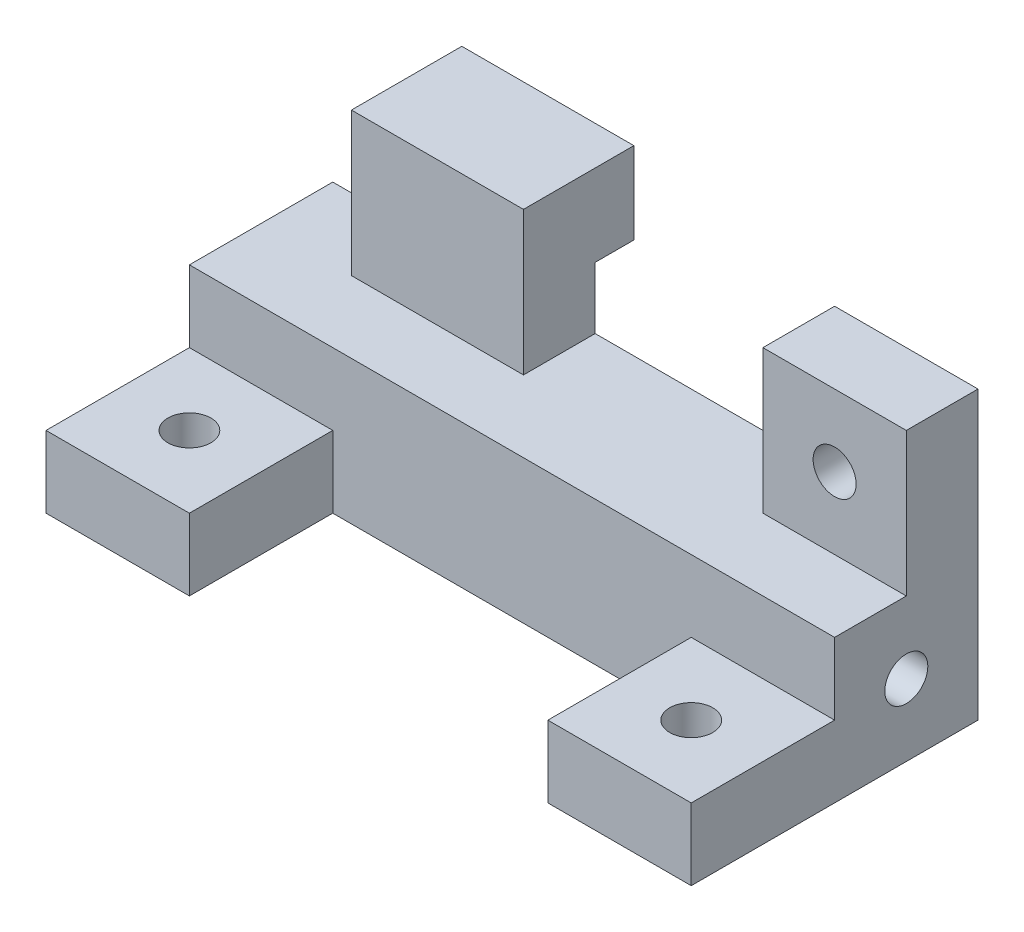
ISO-10303-21;
HEADER;
FILE_DESCRIPTION(('STEP AP214'),'2;1');
FILE_NAME('part.step','',(''),(''),'','','');
FILE_SCHEMA(('AUTOMOTIVE_DESIGN { 1 0 10303 214 1 1 1 1 }'));
ENDSEC;
DATA;
#1=APPLICATION_CONTEXT('core data for automotive mechanical design processes');
#2=APPLICATION_PROTOCOL_DEFINITION('international standard','automotive_design',2000,#1);
#3=PRODUCT_CONTEXT('',#1,'mechanical');
#4=PRODUCT('Part','Part','',(#3));
#5=PRODUCT_RELATED_PRODUCT_CATEGORY('part','',(#4));
#6=PRODUCT_DEFINITION_FORMATION('','',#4);
#7=PRODUCT_DEFINITION_CONTEXT('part definition',#1,'design');
#8=PRODUCT_DEFINITION('design','',#6,#7);
#9=PRODUCT_DEFINITION_SHAPE('','',#8);
#10=(LENGTH_UNIT() NAMED_UNIT(*) SI_UNIT(.MILLI.,.METRE.));
#11=(NAMED_UNIT(*) PLANE_ANGLE_UNIT() SI_UNIT($,.RADIAN.));
#12=(NAMED_UNIT(*) SI_UNIT($,.STERADIAN.) SOLID_ANGLE_UNIT());
#13=UNCERTAINTY_MEASURE_WITH_UNIT(LENGTH_MEASURE(1.E-05),#10,'distance_accuracy_value','');
#14=(GEOMETRIC_REPRESENTATION_CONTEXT(3) GLOBAL_UNCERTAINTY_ASSIGNED_CONTEXT((#13)) GLOBAL_UNIT_ASSIGNED_CONTEXT((#10,
#11,#12)) REPRESENTATION_CONTEXT('',''));
#15=CARTESIAN_POINT('',(0.,0.,0.));
#16=DIRECTION('',(0.,0.,1.));
#17=DIRECTION('',(1.,0.,0.));
#18=AXIS2_PLACEMENT_3D('',#15,#16,#17);
#19=CARTESIAN_POINT('',(0.,0.,10.));
#20=DIRECTION('',(0.,0.,-1.));
#21=DIRECTION('',(-1.,0.,0.));
#22=AXIS2_PLACEMENT_3D('',#19,#20,#21);
#23=PLANE('',#22);
#24=DIRECTION('',(-1.,0.,0.));
#25=VECTOR('',#24,1.);
#26=CARTESIAN_POINT('',(45.,5.,10.));
#27=LINE('',#26,#25);
#28=CARTESIAN_POINT('',(45.,5.,10.));
#29=VERTEX_POINT('',#28);
#30=CARTESIAN_POINT('',(35.,5.,10.));
#31=VERTEX_POINT('',#30);
#32=EDGE_CURVE('E230',#29,#31,#27,.T.);
#33=ORIENTED_EDGE('',*,*,#32,.F.);
#34=DIRECTION('',(0.,1.,0.));
#35=VECTOR('',#34,1.);
#36=CARTESIAN_POINT('',(45.,0.,10.));
#37=LINE('',#36,#35);
#38=CARTESIAN_POINT('',(45.,10.,10.));
#39=VERTEX_POINT('',#38);
#40=EDGE_CURVE('E325',#29,#39,#37,.T.);
#41=ORIENTED_EDGE('',*,*,#40,.T.);
#42=DIRECTION('',(-1.,0.,0.));
#43=VECTOR('',#42,1.);
#44=CARTESIAN_POINT('',(0.,10.,10.));
#45=LINE('',#44,#43);
#46=CARTESIAN_POINT('',(0.,10.,10.));
#47=VERTEX_POINT('',#46);
#48=EDGE_CURVE('E327',#39,#47,#45,.T.);
#49=ORIENTED_EDGE('',*,*,#48,.T.);
#50=DIRECTION('',(0.,-1.,0.));
#51=VECTOR('',#50,1.);
#52=CARTESIAN_POINT('',(0.,0.,10.));
#53=LINE('',#52,#51);
#54=CARTESIAN_POINT('',(0.,5.,10.));
#55=VERTEX_POINT('',#54);
#56=EDGE_CURVE('E320',#47,#55,#53,.T.);
#57=ORIENTED_EDGE('',*,*,#56,.T.);
#58=DIRECTION('',(-1.,0.,0.));
#59=VECTOR('',#58,1.);
#60=CARTESIAN_POINT('',(0.,5.,10.));
#61=LINE('',#60,#59);
#62=CARTESIAN_POINT('',(10.,5.,10.));
#63=VERTEX_POINT('',#62);
#64=EDGE_CURVE('E259',#63,#55,#61,.T.);
#65=ORIENTED_EDGE('',*,*,#64,.F.);
#66=DIRECTION('',(0.,1.,0.));
#67=VECTOR('',#66,1.);
#68=CARTESIAN_POINT('',(10.,0.,10.));
#69=LINE('',#68,#67);
#70=CARTESIAN_POINT('',(9.99999999999999,0.,10.));
#71=VERTEX_POINT('',#70);
#72=EDGE_CURVE('E254',#71,#63,#69,.T.);
#73=ORIENTED_EDGE('',*,*,#72,.F.);
#74=DIRECTION('',(1.,0.,0.));
#75=VECTOR('',#74,1.);
#76=CARTESIAN_POINT('',(0.,0.,10.));
#77=LINE('',#76,#75);
#78=CARTESIAN_POINT('',(35.,0.,10.));
#79=VERTEX_POINT('',#78);
#80=EDGE_CURVE('E322',#71,#79,#77,.T.);
#81=ORIENTED_EDGE('',*,*,#80,.T.);
#82=DIRECTION('',(0.,-1.,0.));
#83=VECTOR('',#82,1.);
#84=CARTESIAN_POINT('',(35.,0.,10.));
#85=LINE('',#84,#83);
#86=EDGE_CURVE('E56',#31,#79,#85,.T.);
#87=ORIENTED_EDGE('',*,*,#86,.F.);
#88=EDGE_LOOP('',(#33,#41,#49,#57,#65,#73,#81,#87));
#89=FACE_BOUND('',#88,.T.);
#90=ADVANCED_FACE('F33',(#89),#23,.F.);
#91=CARTESIAN_POINT('',(0.,10.,10.));
#92=DIRECTION('',(0.,-1.,0.));
#93=DIRECTION('',(0.,0.,-1.));
#94=AXIS2_PLACEMENT_3D('',#91,#92,#93);
#95=PLANE('',#94);
#96=DIRECTION('',(0.,0.,1.));
#97=VECTOR('',#96,1.);
#98=CARTESIAN_POINT('',(6.3,10.,0.));
#99=LINE('',#98,#97);
#100=CARTESIAN_POINT('',(6.3,10.,0.));
#101=VERTEX_POINT('',#100);
#102=CARTESIAN_POINT('',(6.3,10.,5.));
#103=VERTEX_POINT('',#102);
#104=EDGE_CURVE('E277',#101,#103,#99,.T.);
#105=ORIENTED_EDGE('',*,*,#104,.F.);
#106=DIRECTION('',(-1.,0.,0.));
#107=VECTOR('',#106,1.);
#108=CARTESIAN_POINT('',(0.,10.,0.));
#109=LINE('',#108,#107);
#110=CARTESIAN_POINT('',(0.,10.,0.));
#111=VERTEX_POINT('',#110);
#112=EDGE_CURVE('E336',#101,#111,#109,.T.);
#113=ORIENTED_EDGE('',*,*,#112,.T.);
#114=DIRECTION('',(0.,0.,-1.));
#115=VECTOR('',#114,1.);
#116=CARTESIAN_POINT('',(0.,10.,10.));
#117=LINE('',#116,#115);
#118=EDGE_CURVE('E329',#47,#111,#117,.T.);
#119=ORIENTED_EDGE('',*,*,#118,.F.);
#120=ORIENTED_EDGE('',*,*,#48,.F.);
#121=DIRECTION('',(0.,0.,-1.));
#122=VECTOR('',#121,1.);
#123=CARTESIAN_POINT('',(45.,10.,10.));
#124=LINE('',#123,#122);
#125=CARTESIAN_POINT('',(45.,10.,5.));
#126=VERTEX_POINT('',#125);
#127=EDGE_CURVE('E341',#39,#126,#124,.T.);
#128=ORIENTED_EDGE('',*,*,#127,.T.);
#129=DIRECTION('',(1.,0.,0.));
#130=VECTOR('',#129,1.);
#131=CARTESIAN_POINT('',(45.,10.,5.));
#132=LINE('',#131,#130);
#133=CARTESIAN_POINT('',(35.,10.,5.));
#134=VERTEX_POINT('',#133);
#135=EDGE_CURVE('E300',#134,#126,#132,.T.);
#136=ORIENTED_EDGE('',*,*,#135,.F.);
#137=DIRECTION('',(0.,0.,1.));
#138=VECTOR('',#137,1.);
#139=CARTESIAN_POINT('',(35.,10.,0.));
#140=LINE('',#139,#138);
#141=CARTESIAN_POINT('',(35.,10.,0.));
#142=VERTEX_POINT('',#141);
#143=EDGE_CURVE('E295',#142,#134,#140,.T.);
#144=ORIENTED_EDGE('',*,*,#143,.F.);
#145=CARTESIAN_POINT('',(18.3,10.,0.));
#146=VERTEX_POINT('',#145);
#147=EDGE_CURVE('E323',#142,#146,#109,.T.);
#148=ORIENTED_EDGE('',*,*,#147,.T.);
#149=DIRECTION('',(0.,0.,-1.));
#150=VECTOR('',#149,1.);
#151=CARTESIAN_POINT('',(18.3,10.,0.));
#152=LINE('',#151,#150);
#153=CARTESIAN_POINT('',(18.3,10.,5.));
#154=VERTEX_POINT('',#153);
#155=EDGE_CURVE('E177',#154,#146,#152,.T.);
#156=ORIENTED_EDGE('',*,*,#155,.F.);
#157=DIRECTION('',(1.,0.,0.));
#158=VECTOR('',#157,1.);
#159=CARTESIAN_POINT('',(6.3,10.,5.));
#160=LINE('',#159,#158);
#161=EDGE_CURVE('E283',#103,#154,#160,.T.);
#162=ORIENTED_EDGE('',*,*,#161,.F.);
#163=EDGE_LOOP('',(#105,#113,#119,#120,#128,#136,#144,#148,#156,#162));
#164=FACE_BOUND('',#163,.T.);
#165=ADVANCED_FACE('F369',(#164),#95,.F.);
#166=CARTESIAN_POINT('',(0.,0.,10.));
#167=DIRECTION('',(1.,0.,0.));
#168=DIRECTION('',(0.,0.,-1.));
#169=AXIS2_PLACEMENT_3D('',#166,#167,#168);
#170=PLANE('',#169);
#171=CARTESIAN_POINT('',(0.,5.,5.));
#172=DIRECTION('',(-1.,0.,0.));
#173=DIRECTION('',(0.,0.,1.));
#174=AXIS2_PLACEMENT_3D('',#171,#172,#173);
#175=CIRCLE('',#174,1.5);
#176=CARTESIAN_POINT('',(0.,5.,6.5));
#177=VERTEX_POINT('',#176);
#178=EDGE_CURVE('E224',#177,#177,#175,.T.);
#179=ORIENTED_EDGE('',*,*,#178,.F.);
#180=EDGE_LOOP('',(#179));
#181=FACE_BOUND('',#180,.T.);
#182=DIRECTION('',(0.,-1.,0.));
#183=VECTOR('',#182,1.);
#184=CARTESIAN_POINT('',(0.,0.,0.));
#185=LINE('',#184,#183);
#186=CARTESIAN_POINT('',(0.,0.,0.));
#187=VERTEX_POINT('',#186);
#188=EDGE_CURVE('E319',#111,#187,#185,.T.);
#189=ORIENTED_EDGE('',*,*,#188,.T.);
#190=DIRECTION('',(0.,0.,-1.));
#191=VECTOR('',#190,1.);
#192=CARTESIAN_POINT('',(0.,0.,10.));
#193=LINE('',#192,#191);
#194=CARTESIAN_POINT('',(0.,0.,20.));
#195=VERTEX_POINT('',#194);
#196=EDGE_CURVE('E11',#195,#187,#193,.T.);
#197=ORIENTED_EDGE('',*,*,#196,.F.);
#198=DIRECTION('',(0.,-1.,0.));
#199=VECTOR('',#198,1.);
#200=CARTESIAN_POINT('',(0.,0.,20.));
#201=LINE('',#200,#199);
#202=CARTESIAN_POINT('',(0.,5.,20.));
#203=VERTEX_POINT('',#202);
#204=EDGE_CURVE('E255',#203,#195,#201,.T.);
#205=ORIENTED_EDGE('',*,*,#204,.F.);
#206=DIRECTION('',(0.,0.,-1.));
#207=VECTOR('',#206,1.);
#208=CARTESIAN_POINT('',(0.,5.,20.));
#209=LINE('',#208,#207);
#210=EDGE_CURVE('E265',#203,#55,#209,.T.);
#211=ORIENTED_EDGE('',*,*,#210,.T.);
#212=ORIENTED_EDGE('',*,*,#56,.F.);
#213=ORIENTED_EDGE('',*,*,#118,.T.);
#214=EDGE_LOOP('',(#189,#197,#205,#211,#212,#213));
#215=FACE_BOUND('',#214,.T.);
#216=ADVANCED_FACE('F35',(#181,#215),#170,.F.);
#217=CARTESIAN_POINT('',(0.,0.,10.));
#218=DIRECTION('',(0.,1.,0.));
#219=DIRECTION('',(0.,0.,1.));
#220=AXIS2_PLACEMENT_3D('',#217,#218,#219);
#221=PLANE('',#220);
#222=CARTESIAN_POINT('',(40.,0.,15.));
#223=DIRECTION('',(0.,1.,0.));
#224=DIRECTION('',(-1.,0.,0.));
#225=AXIS2_PLACEMENT_3D('',#222,#223,#224);
#226=CIRCLE('',#225,1.5);
#227=CARTESIAN_POINT('',(38.5,0.,15.));
#228=VERTEX_POINT('',#227);
#229=EDGE_CURVE('E209',#228,#228,#226,.T.);
#230=ORIENTED_EDGE('',*,*,#229,.T.);
#231=EDGE_LOOP('',(#230));
#232=FACE_BOUND('',#231,.T.);
#233=CARTESIAN_POINT('',(5.,0.,15.));
#234=DIRECTION('',(0.,1.,0.));
#235=DIRECTION('',(0.,0.,1.));
#236=AXIS2_PLACEMENT_3D('',#233,#234,#235);
#237=CIRCLE('',#236,1.5);
#238=CARTESIAN_POINT('',(5.,0.,16.5));
#239=VERTEX_POINT('',#238);
#240=EDGE_CURVE('E221',#239,#239,#237,.T.);
#241=ORIENTED_EDGE('',*,*,#240,.T.);
#242=EDGE_LOOP('',(#241));
#243=FACE_BOUND('',#242,.T.);
#244=DIRECTION('',(1.,0.,0.));
#245=VECTOR('',#244,1.);
#246=CARTESIAN_POINT('',(0.,0.,0.));
#247=LINE('',#246,#245);
#248=CARTESIAN_POINT('',(45.,0.,0.));
#249=VERTEX_POINT('',#248);
#250=EDGE_CURVE('E332',#187,#249,#247,.T.);
#251=ORIENTED_EDGE('',*,*,#250,.T.);
#252=DIRECTION('',(0.,0.,-1.));
#253=VECTOR('',#252,1.);
#254=CARTESIAN_POINT('',(45.,0.,10.));
#255=LINE('',#254,#253);
#256=CARTESIAN_POINT('',(45.,0.,20.));
#257=VERTEX_POINT('',#256);
#258=EDGE_CURVE('E41',#257,#249,#255,.T.);
#259=ORIENTED_EDGE('',*,*,#258,.F.);
#260=DIRECTION('',(1.,0.,0.));
#261=VECTOR('',#260,1.);
#262=CARTESIAN_POINT('',(45.,0.,20.));
#263=LINE('',#262,#261);
#264=CARTESIAN_POINT('',(35.,0.,20.));
#265=VERTEX_POINT('',#264);
#266=EDGE_CURVE('E240',#265,#257,#263,.T.);
#267=ORIENTED_EDGE('',*,*,#266,.F.);
#268=DIRECTION('',(0.,0.,-1.));
#269=VECTOR('',#268,1.);
#270=CARTESIAN_POINT('',(35.,0.,20.));
#271=LINE('',#270,#269);
#272=EDGE_CURVE('E243',#265,#79,#271,.T.);
#273=ORIENTED_EDGE('',*,*,#272,.T.);
#274=ORIENTED_EDGE('',*,*,#80,.F.);
#275=DIRECTION('',(0.,0.,-1.));
#276=VECTOR('',#275,1.);
#277=CARTESIAN_POINT('',(10.,0.,20.));
#278=LINE('',#277,#276);
#279=CARTESIAN_POINT('',(10.,0.,20.));
#280=VERTEX_POINT('',#279);
#281=EDGE_CURVE('E275',#280,#71,#278,.T.);
#282=ORIENTED_EDGE('',*,*,#281,.F.);
#283=DIRECTION('',(1.,0.,0.));
#284=VECTOR('',#283,1.);
#285=CARTESIAN_POINT('',(0.,0.,20.));
#286=LINE('',#285,#284);
#287=EDGE_CURVE('E258',#195,#280,#286,.T.);
#288=ORIENTED_EDGE('',*,*,#287,.F.);
#289=ORIENTED_EDGE('',*,*,#196,.T.);
#290=EDGE_LOOP('',(#251,#259,#267,#273,#274,#282,#288,#289));
#291=FACE_BOUND('',#290,.T.);
#292=ADVANCED_FACE('F389',(#232,#243,#291),#221,.F.);
#293=CARTESIAN_POINT('',(45.,0.,10.));
#294=DIRECTION('',(-1.,0.,0.));
#295=DIRECTION('',(0.,0.,1.));
#296=AXIS2_PLACEMENT_3D('',#293,#294,#295);
#297=PLANE('',#296);
#298=CARTESIAN_POINT('',(45.,5.,5.));
#299=DIRECTION('',(1.,0.,0.));
#300=DIRECTION('',(0.,0.,-1.));
#301=AXIS2_PLACEMENT_3D('',#298,#299,#300);
#302=CIRCLE('',#301,1.5);
#303=CARTESIAN_POINT('',(45.,5.,3.5));
#304=VERTEX_POINT('',#303);
#305=EDGE_CURVE('E212',#304,#304,#302,.T.);
#306=ORIENTED_EDGE('',*,*,#305,.F.);
#307=EDGE_LOOP('',(#306));
#308=FACE_BOUND('',#307,.T.);
#309=DIRECTION('',(0.,1.,0.));
#310=VECTOR('',#309,1.);
#311=CARTESIAN_POINT('',(45.,0.,0.));
#312=LINE('',#311,#310);
#313=CARTESIAN_POINT('',(45.,20.,0.));
#314=VERTEX_POINT('',#313);
#315=EDGE_CURVE('E334',#249,#314,#312,.T.);
#316=ORIENTED_EDGE('',*,*,#315,.T.);
#317=DIRECTION('',(0.,0.,-1.));
#318=VECTOR('',#317,1.);
#319=CARTESIAN_POINT('',(45.,20.,0.));
#320=LINE('',#319,#318);
#321=CARTESIAN_POINT('',(45.,20.,5.));
#322=VERTEX_POINT('',#321);
#323=EDGE_CURVE('E296',#322,#314,#320,.T.);
#324=ORIENTED_EDGE('',*,*,#323,.F.);
#325=DIRECTION('',(0.,-1.,0.));
#326=VECTOR('',#325,1.);
#327=CARTESIAN_POINT('',(45.,20.,5.));
#328=LINE('',#327,#326);
#329=EDGE_CURVE('E306',#322,#126,#328,.T.);
#330=ORIENTED_EDGE('',*,*,#329,.T.);
#331=ORIENTED_EDGE('',*,*,#127,.F.);
#332=ORIENTED_EDGE('',*,*,#40,.F.);
#333=DIRECTION('',(0.,0.,-1.));
#334=VECTOR('',#333,1.);
#335=CARTESIAN_POINT('',(45.,5.,20.));
#336=LINE('',#335,#334);
#337=CARTESIAN_POINT('',(45.,5.,20.));
#338=VERTEX_POINT('',#337);
#339=EDGE_CURVE('E251',#338,#29,#336,.T.);
#340=ORIENTED_EDGE('',*,*,#339,.F.);
#341=DIRECTION('',(0.,1.,0.));
#342=VECTOR('',#341,1.);
#343=CARTESIAN_POINT('',(45.,0.,20.));
#344=LINE('',#343,#342);
#345=EDGE_CURVE('E233',#257,#338,#344,.T.);
#346=ORIENTED_EDGE('',*,*,#345,.F.);
#347=ORIENTED_EDGE('',*,*,#258,.T.);
#348=EDGE_LOOP('',(#316,#324,#330,#331,#332,#340,#346,#347));
#349=FACE_BOUND('',#348,.T.);
#350=ADVANCED_FACE('F346',(#308,#349),#297,.F.);
#351=CARTESIAN_POINT('',(0.,0.,0.));
#352=DIRECTION('',(0.,0.,-1.));
#353=DIRECTION('',(-1.,0.,0.));
#354=AXIS2_PLACEMENT_3D('',#351,#352,#353);
#355=PLANE('',#354);
#356=DIRECTION('',(-1.,0.,0.));
#357=VECTOR('',#356,1.);
#358=CARTESIAN_POINT('',(6.3,14.2999999999999,0.));
#359=LINE('',#358,#357);
#360=CARTESIAN_POINT('',(18.3,14.2999999999999,0.));
#361=VERTEX_POINT('',#360);
#362=CARTESIAN_POINT('',(6.3,14.2999999999999,0.));
#363=VERTEX_POINT('',#362);
#364=EDGE_CURVE('E48',#361,#363,#359,.T.);
#365=ORIENTED_EDGE('',*,*,#364,.F.);
#366=DIRECTION('',(0.,-1.,0.));
#367=VECTOR('',#366,1.);
#368=CARTESIAN_POINT('',(18.3,20.,0.));
#369=LINE('',#368,#367);
#370=EDGE_CURVE('E289',#361,#146,#369,.T.);
#371=ORIENTED_EDGE('',*,*,#370,.T.);
#372=ORIENTED_EDGE('',*,*,#147,.F.);
#373=DIRECTION('',(0.,-1.,0.));
#374=VECTOR('',#373,1.);
#375=CARTESIAN_POINT('',(35.,20.,0.));
#376=LINE('',#375,#374);
#377=CARTESIAN_POINT('',(35.,20.,0.));
#378=VERTEX_POINT('',#377);
#379=EDGE_CURVE('E316',#378,#142,#376,.T.);
#380=ORIENTED_EDGE('',*,*,#379,.F.);
#381=DIRECTION('',(-1.,0.,0.));
#382=VECTOR('',#381,1.);
#383=CARTESIAN_POINT('',(45.,20.,0.));
#384=LINE('',#383,#382);
#385=EDGE_CURVE('E299',#314,#378,#384,.T.);
#386=ORIENTED_EDGE('',*,*,#385,.F.);
#387=ORIENTED_EDGE('',*,*,#315,.F.);
#388=ORIENTED_EDGE('',*,*,#250,.F.);
#389=ORIENTED_EDGE('',*,*,#188,.F.);
#390=ORIENTED_EDGE('',*,*,#112,.F.);
#391=DIRECTION('',(0.,-1.,0.));
#392=VECTOR('',#391,1.);
#393=CARTESIAN_POINT('',(6.3,20.,0.));
#394=LINE('',#393,#392);
#395=EDGE_CURVE('E281',#363,#101,#394,.T.);
#396=ORIENTED_EDGE('',*,*,#395,.F.);
#397=EDGE_LOOP('',(#365,#371,#372,#380,#386,#387,#388,#389,#390,#396));
#398=FACE_BOUND('',#397,.T.);
#399=CARTESIAN_POINT('',(40.,15.,0.));
#400=DIRECTION('',(0.,0.,1.));
#401=DIRECTION('',(1.,0.,0.));
#402=AXIS2_PLACEMENT_3D('',#399,#400,#401);
#403=CIRCLE('',#402,1.5);
#404=CARTESIAN_POINT('',(41.5,15.,0.));
#405=VERTEX_POINT('',#404);
#406=EDGE_CURVE('E203',#405,#405,#403,.T.);
#407=ORIENTED_EDGE('',*,*,#406,.T.);
#408=EDGE_LOOP('',(#407));
#409=FACE_BOUND('',#408,.T.);
#410=ADVANCED_FACE('F352',(#398,#409),#355,.T.);
#411=CARTESIAN_POINT('',(35.,20.,0.));
#412=DIRECTION('',(1.,0.,0.));
#413=DIRECTION('',(0.,0.,-1.));
#414=AXIS2_PLACEMENT_3D('',#411,#412,#413);
#415=PLANE('',#414);
#416=ORIENTED_EDGE('',*,*,#143,.T.);
#417=DIRECTION('',(0.,-1.,0.));
#418=VECTOR('',#417,1.);
#419=CARTESIAN_POINT('',(35.,20.,5.));
#420=LINE('',#419,#418);
#421=CARTESIAN_POINT('',(35.,20.,5.));
#422=VERTEX_POINT('',#421);
#423=EDGE_CURVE('E313',#422,#134,#420,.T.);
#424=ORIENTED_EDGE('',*,*,#423,.F.);
#425=DIRECTION('',(0.,0.,1.));
#426=VECTOR('',#425,1.);
#427=CARTESIAN_POINT('',(35.,20.,0.));
#428=LINE('',#427,#426);
#429=EDGE_CURVE('E302',#378,#422,#428,.T.);
#430=ORIENTED_EDGE('',*,*,#429,.F.);
#431=ORIENTED_EDGE('',*,*,#379,.T.);
#432=EDGE_LOOP('',(#416,#424,#430,#431));
#433=FACE_BOUND('',#432,.T.);
#434=ADVANCED_FACE('F371',(#433),#415,.F.);
#435=CARTESIAN_POINT('',(45.,20.,5.));
#436=DIRECTION('',(0.,0.,-1.));
#437=DIRECTION('',(-1.,0.,0.));
#438=AXIS2_PLACEMENT_3D('',#435,#436,#437);
#439=PLANE('',#438);
#440=CARTESIAN_POINT('',(40.,15.,5.));
#441=DIRECTION('',(0.,0.,1.));
#442=DIRECTION('',(1.,0.,0.));
#443=AXIS2_PLACEMENT_3D('',#440,#441,#442);
#444=CIRCLE('',#443,1.5);
#445=CARTESIAN_POINT('',(41.5,15.,5.));
#446=VERTEX_POINT('',#445);
#447=EDGE_CURVE('E202',#446,#446,#444,.T.);
#448=ORIENTED_EDGE('',*,*,#447,.F.);
#449=EDGE_LOOP('',(#448));
#450=FACE_BOUND('',#449,.T.);
#451=ORIENTED_EDGE('',*,*,#135,.T.);
#452=ORIENTED_EDGE('',*,*,#329,.F.);
#453=DIRECTION('',(1.,0.,0.));
#454=VECTOR('',#453,1.);
#455=CARTESIAN_POINT('',(45.,20.,5.));
#456=LINE('',#455,#454);
#457=EDGE_CURVE('E304',#422,#322,#456,.T.);
#458=ORIENTED_EDGE('',*,*,#457,.F.);
#459=ORIENTED_EDGE('',*,*,#423,.T.);
#460=EDGE_LOOP('',(#451,#452,#458,#459));
#461=FACE_BOUND('',#460,.T.);
#462=ADVANCED_FACE('F365',(#450,#461),#439,.F.);
#463=CARTESIAN_POINT('',(0.,20.,0.));
#464=DIRECTION('',(0.,-1.,0.));
#465=DIRECTION('',(0.,0.,-1.));
#466=AXIS2_PLACEMENT_3D('',#463,#464,#465);
#467=PLANE('',#466);
#468=ORIENTED_EDGE('',*,*,#323,.T.);
#469=ORIENTED_EDGE('',*,*,#385,.T.);
#470=ORIENTED_EDGE('',*,*,#429,.T.);
#471=ORIENTED_EDGE('',*,*,#457,.T.);
#472=EDGE_LOOP('',(#468,#469,#470,#471));
#473=FACE_BOUND('',#472,.T.);
#474=ADVANCED_FACE('F359',(#473),#467,.F.);
#475=CARTESIAN_POINT('',(6.3,20.,0.));
#476=DIRECTION('',(1.,0.,0.));
#477=DIRECTION('',(0.,0.,-1.));
#478=AXIS2_PLACEMENT_3D('',#475,#476,#477);
#479=PLANE('',#478);
#480=ORIENTED_EDGE('',*,*,#104,.T.);
#481=DIRECTION('',(0.,-1.,0.));
#482=VECTOR('',#481,1.);
#483=CARTESIAN_POINT('',(6.3,20.,5.));
#484=LINE('',#483,#482);
#485=CARTESIAN_POINT('',(6.3,20.,5.));
#486=VERTEX_POINT('',#485);
#487=EDGE_CURVE('E174',#486,#103,#484,.T.);
#488=ORIENTED_EDGE('',*,*,#487,.F.);
#489=DIRECTION('',(0.,0.,1.));
#490=VECTOR('',#489,1.);
#491=CARTESIAN_POINT('',(6.3,20.,0.));
#492=LINE('',#491,#490);
#493=CARTESIAN_POINT('',(6.3,20.,-2.7));
#494=VERTEX_POINT('',#493);
#495=EDGE_CURVE('E166',#494,#486,#492,.T.);
#496=ORIENTED_EDGE('',*,*,#495,.F.);
#497=DIRECTION('',(0.,1.,0.));
#498=VECTOR('',#497,1.);
#499=CARTESIAN_POINT('',(6.3,20.,-2.7));
#500=LINE('',#499,#498);
#501=CARTESIAN_POINT('',(6.3,14.2999999999999,-2.7));
#502=VERTEX_POINT('',#501);
#503=EDGE_CURVE('E172',#502,#494,#500,.T.);
#504=ORIENTED_EDGE('',*,*,#503,.F.);
#505=DIRECTION('',(0.,0.,1.));
#506=VECTOR('',#505,1.);
#507=CARTESIAN_POINT('',(6.3,14.2999999999999,-2.7));
#508=LINE('',#507,#506);
#509=EDGE_CURVE('E196',#502,#363,#508,.T.);
#510=ORIENTED_EDGE('',*,*,#509,.T.);
#511=ORIENTED_EDGE('',*,*,#395,.T.);
#512=EDGE_LOOP('',(#480,#488,#496,#504,#510,#511));
#513=FACE_BOUND('',#512,.T.);
#514=ADVANCED_FACE('F169',(#513),#479,.F.);
#515=CARTESIAN_POINT('',(6.3,20.,5.));
#516=DIRECTION('',(0.,0.,-1.));
#517=DIRECTION('',(-1.,0.,0.));
#518=AXIS2_PLACEMENT_3D('',#515,#516,#517);
#519=PLANE('',#518);
#520=ORIENTED_EDGE('',*,*,#161,.T.);
#521=DIRECTION('',(0.,-1.,0.));
#522=VECTOR('',#521,1.);
#523=CARTESIAN_POINT('',(18.3,20.,5.));
#524=LINE('',#523,#522);
#525=CARTESIAN_POINT('',(18.3,20.,5.));
#526=VERTEX_POINT('',#525);
#527=EDGE_CURVE('E291',#526,#154,#524,.T.);
#528=ORIENTED_EDGE('',*,*,#527,.F.);
#529=DIRECTION('',(1.,0.,0.));
#530=VECTOR('',#529,1.);
#531=CARTESIAN_POINT('',(6.3,20.,5.));
#532=LINE('',#531,#530);
#533=EDGE_CURVE('E176',#486,#526,#532,.T.);
#534=ORIENTED_EDGE('',*,*,#533,.F.);
#535=ORIENTED_EDGE('',*,*,#487,.T.);
#536=EDGE_LOOP('',(#520,#528,#534,#535));
#537=FACE_BOUND('',#536,.T.);
#538=ADVANCED_FACE('F414',(#537),#519,.F.);
#539=CARTESIAN_POINT('',(18.3,20.,0.));
#540=DIRECTION('',(-1.,0.,0.));
#541=DIRECTION('',(0.,0.,1.));
#542=AXIS2_PLACEMENT_3D('',#539,#540,#541);
#543=PLANE('',#542);
#544=ORIENTED_EDGE('',*,*,#155,.T.);
#545=ORIENTED_EDGE('',*,*,#370,.F.);
#546=DIRECTION('',(0.,0.,1.));
#547=VECTOR('',#546,1.);
#548=CARTESIAN_POINT('',(18.3,14.2999999999999,-2.7));
#549=LINE('',#548,#547);
#550=CARTESIAN_POINT('',(18.3,14.2999999999999,-2.7));
#551=VERTEX_POINT('',#550);
#552=EDGE_CURVE('E199',#551,#361,#549,.T.);
#553=ORIENTED_EDGE('',*,*,#552,.F.);
#554=DIRECTION('',(0.,-1.,0.));
#555=VECTOR('',#554,1.);
#556=CARTESIAN_POINT('',(18.3,20.,-2.7));
#557=LINE('',#556,#555);
#558=CARTESIAN_POINT('',(18.3,20.,-2.7));
#559=VERTEX_POINT('',#558);
#560=EDGE_CURVE('E186',#559,#551,#557,.T.);
#561=ORIENTED_EDGE('',*,*,#560,.F.);
#562=DIRECTION('',(0.,0.,-1.));
#563=VECTOR('',#562,1.);
#564=CARTESIAN_POINT('',(18.3,20.,0.));
#565=LINE('',#564,#563);
#566=EDGE_CURVE('E183',#526,#559,#565,.T.);
#567=ORIENTED_EDGE('',*,*,#566,.F.);
#568=ORIENTED_EDGE('',*,*,#527,.T.);
#569=EDGE_LOOP('',(#544,#545,#553,#561,#567,#568));
#570=FACE_BOUND('',#569,.T.);
#571=ADVANCED_FACE('F411',(#570),#543,.F.);
#572=CARTESIAN_POINT('',(0.,20.,0.));
#573=DIRECTION('',(0.,1.,0.));
#574=DIRECTION('',(0.,0.,1.));
#575=AXIS2_PLACEMENT_3D('',#572,#573,#574);
#576=PLANE('',#575);
#577=ORIENTED_EDGE('',*,*,#495,.T.);
#578=ORIENTED_EDGE('',*,*,#533,.T.);
#579=ORIENTED_EDGE('',*,*,#566,.T.);
#580=DIRECTION('',(1.,0.,0.));
#581=VECTOR('',#580,1.);
#582=CARTESIAN_POINT('',(6.3,20.,-2.7));
#583=LINE('',#582,#581);
#584=EDGE_CURVE('E180',#494,#559,#583,.T.);
#585=ORIENTED_EDGE('',*,*,#584,.F.);
#586=EDGE_LOOP('',(#577,#578,#579,#585));
#587=FACE_BOUND('',#586,.T.);
#588=ADVANCED_FACE('F181',(#587),#576,.T.);
#589=CARTESIAN_POINT('',(10.,0.,20.));
#590=DIRECTION('',(-1.,0.,0.));
#591=DIRECTION('',(0.,-1.,0.));
#592=AXIS2_PLACEMENT_3D('',#589,#590,#591);
#593=PLANE('',#592);
#594=ORIENTED_EDGE('',*,*,#72,.T.);
#595=DIRECTION('',(0.,0.,-1.));
#596=VECTOR('',#595,1.);
#597=CARTESIAN_POINT('',(10.,5.,20.));
#598=LINE('',#597,#596);
#599=CARTESIAN_POINT('',(10.,5.,20.));
#600=VERTEX_POINT('',#599);
#601=EDGE_CURVE('E272',#600,#63,#598,.T.);
#602=ORIENTED_EDGE('',*,*,#601,.F.);
#603=DIRECTION('',(0.,1.,0.));
#604=VECTOR('',#603,1.);
#605=CARTESIAN_POINT('',(10.,0.,20.));
#606=LINE('',#605,#604);
#607=EDGE_CURVE('E261',#280,#600,#606,.T.);
#608=ORIENTED_EDGE('',*,*,#607,.F.);
#609=ORIENTED_EDGE('',*,*,#281,.T.);
#610=EDGE_LOOP('',(#594,#602,#608,#609));
#611=FACE_BOUND('',#610,.T.);
#612=ADVANCED_FACE('F456',(#611),#593,.F.);
#613=CARTESIAN_POINT('',(0.,5.,20.));
#614=DIRECTION('',(0.,-1.,0.));
#615=DIRECTION('',(0.,0.,-1.));
#616=AXIS2_PLACEMENT_3D('',#613,#614,#615);
#617=PLANE('',#616);
#618=CARTESIAN_POINT('',(5.,5.,15.));
#619=DIRECTION('',(0.,1.,0.));
#620=DIRECTION('',(0.,0.,1.));
#621=AXIS2_PLACEMENT_3D('',#618,#619,#620);
#622=CIRCLE('',#621,1.5);
#623=CARTESIAN_POINT('',(5.,5.,16.5));
#624=VERTEX_POINT('',#623);
#625=EDGE_CURVE('E218',#624,#624,#622,.T.);
#626=ORIENTED_EDGE('',*,*,#625,.F.);
#627=EDGE_LOOP('',(#626));
#628=FACE_BOUND('',#627,.T.);
#629=ORIENTED_EDGE('',*,*,#64,.T.);
#630=ORIENTED_EDGE('',*,*,#210,.F.);
#631=DIRECTION('',(-1.,0.,0.));
#632=VECTOR('',#631,1.);
#633=CARTESIAN_POINT('',(0.,5.,20.));
#634=LINE('',#633,#632);
#635=EDGE_CURVE('E263',#600,#203,#634,.T.);
#636=ORIENTED_EDGE('',*,*,#635,.F.);
#637=ORIENTED_EDGE('',*,*,#601,.T.);
#638=EDGE_LOOP('',(#629,#630,#636,#637));
#639=FACE_BOUND('',#638,.T.);
#640=ADVANCED_FACE('F521',(#628,#639),#617,.F.);
#641=CARTESIAN_POINT('',(0.,0.,20.));
#642=DIRECTION('',(0.,0.,-1.));
#643=DIRECTION('',(-1.,0.,0.));
#644=AXIS2_PLACEMENT_3D('',#641,#642,#643);
#645=PLANE('',#644);
#646=ORIENTED_EDGE('',*,*,#204,.T.);
#647=ORIENTED_EDGE('',*,*,#287,.T.);
#648=ORIENTED_EDGE('',*,*,#607,.T.);
#649=ORIENTED_EDGE('',*,*,#635,.T.);
#650=EDGE_LOOP('',(#646,#647,#648,#649));
#651=FACE_BOUND('',#650,.T.);
#652=ADVANCED_FACE('F517',(#651),#645,.F.);
#653=CARTESIAN_POINT('',(45.,5.,20.));
#654=DIRECTION('',(0.,-1.,0.));
#655=DIRECTION('',(1.,0.,0.));
#656=AXIS2_PLACEMENT_3D('',#653,#654,#655);
#657=PLANE('',#656);
#658=CARTESIAN_POINT('',(40.,5.,15.));
#659=DIRECTION('',(0.,1.,0.));
#660=DIRECTION('',(-1.,0.,0.));
#661=AXIS2_PLACEMENT_3D('',#658,#659,#660);
#662=CIRCLE('',#661,1.5);
#663=CARTESIAN_POINT('',(38.5,5.,15.));
#664=VERTEX_POINT('',#663);
#665=EDGE_CURVE('E206',#664,#664,#662,.T.);
#666=ORIENTED_EDGE('',*,*,#665,.F.);
#667=EDGE_LOOP('',(#666));
#668=FACE_BOUND('',#667,.T.);
#669=ORIENTED_EDGE('',*,*,#32,.T.);
#670=DIRECTION('',(0.,0.,-1.));
#671=VECTOR('',#670,1.);
#672=CARTESIAN_POINT('',(35.,5.,20.));
#673=LINE('',#672,#671);
#674=CARTESIAN_POINT('',(35.,5.,20.));
#675=VERTEX_POINT('',#674);
#676=EDGE_CURVE('E248',#675,#31,#673,.T.);
#677=ORIENTED_EDGE('',*,*,#676,.F.);
#678=DIRECTION('',(-1.,0.,0.));
#679=VECTOR('',#678,1.);
#680=CARTESIAN_POINT('',(45.,5.,20.));
#681=LINE('',#680,#679);
#682=EDGE_CURVE('E236',#338,#675,#681,.T.);
#683=ORIENTED_EDGE('',*,*,#682,.F.);
#684=ORIENTED_EDGE('',*,*,#339,.T.);
#685=EDGE_LOOP('',(#669,#677,#683,#684));
#686=FACE_BOUND('',#685,.T.);
#687=ADVANCED_FACE('F513',(#668,#686),#657,.F.);
#688=CARTESIAN_POINT('',(35.,0.,20.));
#689=DIRECTION('',(1.,0.,0.));
#690=DIRECTION('',(0.,0.,-1.));
#691=AXIS2_PLACEMENT_3D('',#688,#689,#690);
#692=PLANE('',#691);
#693=ORIENTED_EDGE('',*,*,#86,.T.);
#694=ORIENTED_EDGE('',*,*,#272,.F.);
#695=DIRECTION('',(0.,-1.,0.));
#696=VECTOR('',#695,1.);
#697=CARTESIAN_POINT('',(35.,0.,20.));
#698=LINE('',#697,#696);
#699=EDGE_CURVE('E238',#675,#265,#698,.T.);
#700=ORIENTED_EDGE('',*,*,#699,.F.);
#701=ORIENTED_EDGE('',*,*,#676,.T.);
#702=EDGE_LOOP('',(#693,#694,#700,#701));
#703=FACE_BOUND('',#702,.T.);
#704=ADVANCED_FACE('F509',(#703),#692,.F.);
#705=CARTESIAN_POINT('',(0.,0.,20.));
#706=DIRECTION('',(0.,0.,1.));
#707=DIRECTION('',(1.,0.,0.));
#708=AXIS2_PLACEMENT_3D('',#705,#706,#707);
#709=PLANE('',#708);
#710=ORIENTED_EDGE('',*,*,#345,.T.);
#711=ORIENTED_EDGE('',*,*,#682,.T.);
#712=ORIENTED_EDGE('',*,*,#699,.T.);
#713=ORIENTED_EDGE('',*,*,#266,.T.);
#714=EDGE_LOOP('',(#710,#711,#712,#713));
#715=FACE_BOUND('',#714,.T.);
#716=ADVANCED_FACE('F505',(#715),#709,.T.);
#717=CARTESIAN_POINT('',(5.,5.,5.));
#718=DIRECTION('',(-1.,0.,0.));
#719=DIRECTION('',(0.,0.,1.));
#720=AXIS2_PLACEMENT_3D('',#717,#718,#719);
#721=CYLINDRICAL_SURFACE('',#720,1.5);
#722=CARTESIAN_POINT('',(5.,5.,5.));
#723=DIRECTION('',(-1.,0.,0.));
#724=DIRECTION('',(0.,0.,1.));
#725=AXIS2_PLACEMENT_3D('',#722,#723,#724);
#726=CIRCLE('',#725,1.5);
#727=CARTESIAN_POINT('',(5.,5.,6.5));
#728=VERTEX_POINT('',#727);
#729=EDGE_CURVE('E227',#728,#728,#726,.T.);
#730=ORIENTED_EDGE('',*,*,#729,.F.);
#731=EDGE_LOOP('',(#730));
#732=FACE_BOUND('',#731,.T.);
#733=ORIENTED_EDGE('',*,*,#178,.T.);
#734=EDGE_LOOP('',(#733));
#735=FACE_BOUND('',#734,.T.);
#736=ADVANCED_FACE('F501',(#732,#735),#721,.F.);
#737=CARTESIAN_POINT('',(5.,5.,5.));
#738=DIRECTION('',(-1.,0.,0.));
#739=DIRECTION('',(0.,0.,1.));
#740=AXIS2_PLACEMENT_3D('',#737,#738,#739);
#741=PLANE('',#740);
#742=ORIENTED_EDGE('',*,*,#729,.T.);
#743=EDGE_LOOP('',(#742));
#744=FACE_BOUND('',#743,.T.);
#745=ADVANCED_FACE('F497',(#744),#741,.T.);
#746=CARTESIAN_POINT('',(5.,0.,15.));
#747=DIRECTION('',(0.,1.,0.));
#748=DIRECTION('',(0.,0.,1.));
#749=AXIS2_PLACEMENT_3D('',#746,#747,#748);
#750=CYLINDRICAL_SURFACE('',#749,1.5);
#751=ORIENTED_EDGE('',*,*,#240,.F.);
#752=EDGE_LOOP('',(#751));
#753=FACE_BOUND('',#752,.T.);
#754=ORIENTED_EDGE('',*,*,#625,.T.);
#755=EDGE_LOOP('',(#754));
#756=FACE_BOUND('',#755,.T.);
#757=ADVANCED_FACE('F493',(#753,#756),#750,.F.);
#758=CARTESIAN_POINT('',(40.,5.,5.));
#759=DIRECTION('',(1.,0.,0.));
#760=DIRECTION('',(0.,0.,-1.));
#761=AXIS2_PLACEMENT_3D('',#758,#759,#760);
#762=CYLINDRICAL_SURFACE('',#761,1.5);
#763=CARTESIAN_POINT('',(40.,5.,5.));
#764=DIRECTION('',(1.,0.,0.));
#765=DIRECTION('',(0.,0.,-1.));
#766=AXIS2_PLACEMENT_3D('',#763,#764,#765);
#767=CIRCLE('',#766,1.5);
#768=CARTESIAN_POINT('',(40.,5.,3.5));
#769=VERTEX_POINT('',#768);
#770=EDGE_CURVE('E215',#769,#769,#767,.T.);
#771=ORIENTED_EDGE('',*,*,#770,.F.);
#772=EDGE_LOOP('',(#771));
#773=FACE_BOUND('',#772,.T.);
#774=ORIENTED_EDGE('',*,*,#305,.T.);
#775=EDGE_LOOP('',(#774));
#776=FACE_BOUND('',#775,.T.);
#777=ADVANCED_FACE('F489',(#773,#776),#762,.F.);
#778=CARTESIAN_POINT('',(40.,5.,5.));
#779=DIRECTION('',(1.,0.,0.));
#780=DIRECTION('',(0.,0.,-1.));
#781=AXIS2_PLACEMENT_3D('',#778,#779,#780);
#782=PLANE('',#781);
#783=ORIENTED_EDGE('',*,*,#770,.T.);
#784=EDGE_LOOP('',(#783));
#785=FACE_BOUND('',#784,.T.);
#786=ADVANCED_FACE('F485',(#785),#782,.T.);
#787=CARTESIAN_POINT('',(40.,0.,15.));
#788=DIRECTION('',(0.,1.,0.));
#789=DIRECTION('',(-1.,0.,0.));
#790=AXIS2_PLACEMENT_3D('',#787,#788,#789);
#791=CYLINDRICAL_SURFACE('',#790,1.5);
#792=ORIENTED_EDGE('',*,*,#229,.F.);
#793=EDGE_LOOP('',(#792));
#794=FACE_BOUND('',#793,.T.);
#795=ORIENTED_EDGE('',*,*,#665,.T.);
#796=EDGE_LOOP('',(#795));
#797=FACE_BOUND('',#796,.T.);
#798=ADVANCED_FACE('F481',(#794,#797),#791,.F.);
#799=CARTESIAN_POINT('',(40.,15.,0.));
#800=DIRECTION('',(0.,0.,1.));
#801=DIRECTION('',(1.,0.,0.));
#802=AXIS2_PLACEMENT_3D('',#799,#800,#801);
#803=CYLINDRICAL_SURFACE('',#802,1.5);
#804=ORIENTED_EDGE('',*,*,#406,.F.);
#805=EDGE_LOOP('',(#804));
#806=FACE_BOUND('',#805,.T.);
#807=ORIENTED_EDGE('',*,*,#447,.T.);
#808=EDGE_LOOP('',(#807));
#809=FACE_BOUND('',#808,.T.);
#810=ADVANCED_FACE('F466',(#806,#809),#803,.F.);
#811=CARTESIAN_POINT('',(6.3,14.2999999999999,-2.7));
#812=DIRECTION('',(0.,1.,0.));
#813=DIRECTION('',(0.,0.,1.));
#814=AXIS2_PLACEMENT_3D('',#811,#812,#813);
#815=PLANE('',#814);
#816=ORIENTED_EDGE('',*,*,#364,.T.);
#817=ORIENTED_EDGE('',*,*,#509,.F.);
#818=DIRECTION('',(-1.,0.,0.));
#819=VECTOR('',#818,1.);
#820=CARTESIAN_POINT('',(6.3,14.2999999999999,-2.7));
#821=LINE('',#820,#819);
#822=EDGE_CURVE('E190',#551,#502,#821,.T.);
#823=ORIENTED_EDGE('',*,*,#822,.F.);
#824=ORIENTED_EDGE('',*,*,#552,.T.);
#825=EDGE_LOOP('',(#816,#817,#823,#824));
#826=FACE_BOUND('',#825,.T.);
#827=ADVANCED_FACE('F408',(#826),#815,.F.);
#828=CARTESIAN_POINT('',(0.,0.,-2.7));
#829=DIRECTION('',(0.,0.,1.));
#830=DIRECTION('',(1.,0.,0.));
#831=AXIS2_PLACEMENT_3D('',#828,#829,#830);
#832=PLANE('',#831);
#833=ORIENTED_EDGE('',*,*,#503,.T.);
#834=ORIENTED_EDGE('',*,*,#584,.T.);
#835=ORIENTED_EDGE('',*,*,#560,.T.);
#836=ORIENTED_EDGE('',*,*,#822,.T.);
#837=EDGE_LOOP('',(#833,#834,#835,#836));
#838=FACE_BOUND('',#837,.T.);
#839=ADVANCED_FACE('F188',(#838),#832,.F.);
#840=CLOSED_SHELL('',(#90,#165,#216,#292,#350,#410,#434,#462,#474,#514,#538,#571,#588,#612,#640,
#652,#687,#704,#716,#736,#745,#757,#777,#786,#798,#810,#827,#839));
#841=MANIFOLD_SOLID_BREP('B2',#840);
#842=ADVANCED_BREP_SHAPE_REPRESENTATION('',(#18,#841),#14);
#843=SHAPE_DEFINITION_REPRESENTATION(#9,#842);
ENDSEC;
END-ISO-10303-21;
